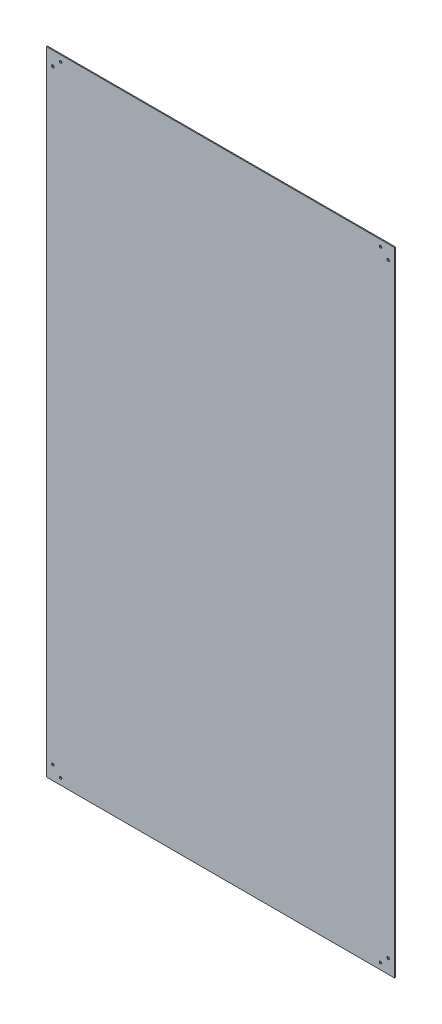
ISO-10303-21;
HEADER;
FILE_DESCRIPTION(('STEP AP214'),'2;1');
FILE_NAME('part.step','',(''),(''),'','','');
FILE_SCHEMA(('AUTOMOTIVE_DESIGN { 1 0 10303 214 1 1 1 1 }'));
ENDSEC;
DATA;
#1=APPLICATION_CONTEXT('core data for automotive mechanical design processes');
#2=APPLICATION_PROTOCOL_DEFINITION('international standard','automotive_design',2000,#1);
#3=PRODUCT_CONTEXT('',#1,'mechanical');
#4=PRODUCT('Part','Part','',(#3));
#5=PRODUCT_RELATED_PRODUCT_CATEGORY('part','',(#4));
#6=PRODUCT_DEFINITION_FORMATION('','',#4);
#7=PRODUCT_DEFINITION_CONTEXT('part definition',#1,'design');
#8=PRODUCT_DEFINITION('design','',#6,#7);
#9=PRODUCT_DEFINITION_SHAPE('','',#8);
#10=(LENGTH_UNIT() NAMED_UNIT(*) SI_UNIT(.MILLI.,.METRE.));
#11=(NAMED_UNIT(*) PLANE_ANGLE_UNIT() SI_UNIT($,.RADIAN.));
#12=(NAMED_UNIT(*) SI_UNIT($,.STERADIAN.) SOLID_ANGLE_UNIT());
#13=UNCERTAINTY_MEASURE_WITH_UNIT(LENGTH_MEASURE(1.E-05),#10,'distance_accuracy_value','');
#14=(GEOMETRIC_REPRESENTATION_CONTEXT(3) GLOBAL_UNCERTAINTY_ASSIGNED_CONTEXT((#13)) GLOBAL_UNIT_ASSIGNED_CONTEXT((#10,
#11,#12)) REPRESENTATION_CONTEXT('',''));
#15=CARTESIAN_POINT('',(0.,0.,0.));
#16=DIRECTION('',(0.,0.,1.));
#17=DIRECTION('',(1.,0.,0.));
#18=AXIS2_PLACEMENT_3D('',#15,#16,#17);
#19=CARTESIAN_POINT('',(-550.,-1000.,-3.));
#20=DIRECTION('',(0.,-1.,0.));
#21=DIRECTION('',(0.,0.,-1.));
#22=AXIS2_PLACEMENT_3D('',#19,#20,#21);
#23=PLANE('',#22);
#24=DIRECTION('',(1.,0.,0.));
#25=VECTOR('',#24,1.);
#26=CARTESIAN_POINT('',(-550.,-1000.,0.));
#27=LINE('',#26,#25);
#28=CARTESIAN_POINT('',(-550.,-1000.,0.));
#29=VERTEX_POINT('',#28);
#30=CARTESIAN_POINT('',(550.,-1000.,0.));
#31=VERTEX_POINT('',#30);
#32=EDGE_CURVE('E100',#29,#31,#27,.T.);
#33=ORIENTED_EDGE('',*,*,#32,.F.);
#34=DIRECTION('',(0.,0.,1.));
#35=VECTOR('',#34,1.);
#36=CARTESIAN_POINT('',(-550.,-1000.,-3.));
#37=LINE('',#36,#35);
#38=CARTESIAN_POINT('',(-550.,-1000.,-3.));
#39=VERTEX_POINT('',#38);
#40=EDGE_CURVE('E11',#39,#29,#37,.T.);
#41=ORIENTED_EDGE('',*,*,#40,.F.);
#42=DIRECTION('',(1.,0.,0.));
#43=VECTOR('',#42,1.);
#44=CARTESIAN_POINT('',(-550.,-1000.,-3.));
#45=LINE('',#44,#43);
#46=CARTESIAN_POINT('',(550.,-1000.,-3.));
#47=VERTEX_POINT('',#46);
#48=EDGE_CURVE('E93',#39,#47,#45,.T.);
#49=ORIENTED_EDGE('',*,*,#48,.T.);
#50=DIRECTION('',(0.,0.,1.));
#51=VECTOR('',#50,1.);
#52=CARTESIAN_POINT('',(550.,-1000.,-3.));
#53=LINE('',#52,#51);
#54=EDGE_CURVE('E38',#47,#31,#53,.T.);
#55=ORIENTED_EDGE('',*,*,#54,.T.);
#56=EDGE_LOOP('',(#33,#41,#49,#55));
#57=FACE_BOUND('',#56,.T.);
#58=ADVANCED_FACE('F35',(#57),#23,.T.);
#59=CARTESIAN_POINT('',(-550.,1000.,-3.));
#60=DIRECTION('',(-1.,0.,0.));
#61=DIRECTION('',(0.,-1.,0.));
#62=AXIS2_PLACEMENT_3D('',#59,#60,#61);
#63=PLANE('',#62);
#64=DIRECTION('',(0.,-1.,0.));
#65=VECTOR('',#64,1.);
#66=CARTESIAN_POINT('',(-550.,1000.,0.));
#67=LINE('',#66,#65);
#68=CARTESIAN_POINT('',(-550.,1000.,0.));
#69=VERTEX_POINT('',#68);
#70=EDGE_CURVE('E95',#69,#29,#67,.T.);
#71=ORIENTED_EDGE('',*,*,#70,.F.);
#72=DIRECTION('',(0.,0.,1.));
#73=VECTOR('',#72,1.);
#74=CARTESIAN_POINT('',(-550.,1000.,-3.));
#75=LINE('',#74,#73);
#76=CARTESIAN_POINT('',(-550.,1000.,-3.));
#77=VERTEX_POINT('',#76);
#78=EDGE_CURVE('E44',#77,#69,#75,.T.);
#79=ORIENTED_EDGE('',*,*,#78,.F.);
#80=DIRECTION('',(0.,-1.,0.));
#81=VECTOR('',#80,1.);
#82=CARTESIAN_POINT('',(-550.,1000.,-3.));
#83=LINE('',#82,#81);
#84=EDGE_CURVE('E83',#77,#39,#83,.T.);
#85=ORIENTED_EDGE('',*,*,#84,.T.);
#86=ORIENTED_EDGE('',*,*,#40,.T.);
#87=EDGE_LOOP('',(#71,#79,#85,#86));
#88=FACE_BOUND('',#87,.T.);
#89=ADVANCED_FACE('F111',(#88),#63,.T.);
#90=CARTESIAN_POINT('',(-550.,1000.,-3.));
#91=DIRECTION('',(0.,-1.,0.));
#92=DIRECTION('',(0.,0.,-1.));
#93=AXIS2_PLACEMENT_3D('',#90,#91,#92);
#94=PLANE('',#93);
#95=DIRECTION('',(1.,0.,0.));
#96=VECTOR('',#95,1.);
#97=CARTESIAN_POINT('',(-550.,1000.,0.));
#98=LINE('',#97,#96);
#99=CARTESIAN_POINT('',(550.,1000.,0.));
#100=VERTEX_POINT('',#99);
#101=EDGE_CURVE('E88',#69,#100,#98,.T.);
#102=ORIENTED_EDGE('',*,*,#101,.T.);
#103=DIRECTION('',(0.,0.,1.));
#104=VECTOR('',#103,1.);
#105=CARTESIAN_POINT('',(550.,1000.,-3.));
#106=LINE('',#105,#104);
#107=CARTESIAN_POINT('',(550.,1000.,-3.));
#108=VERTEX_POINT('',#107);
#109=EDGE_CURVE('E86',#108,#100,#106,.T.);
#110=ORIENTED_EDGE('',*,*,#109,.F.);
#111=DIRECTION('',(1.,0.,0.));
#112=VECTOR('',#111,1.);
#113=CARTESIAN_POINT('',(-550.,1000.,-3.));
#114=LINE('',#113,#112);
#115=EDGE_CURVE('E80',#77,#108,#114,.T.);
#116=ORIENTED_EDGE('',*,*,#115,.F.);
#117=ORIENTED_EDGE('',*,*,#78,.T.);
#118=EDGE_LOOP('',(#102,#110,#116,#117));
#119=FACE_BOUND('',#118,.T.);
#120=ADVANCED_FACE('F87',(#119),#94,.F.);
#121=CARTESIAN_POINT('',(550.,1000.,-3.));
#122=DIRECTION('',(-1.,0.,0.));
#123=DIRECTION('',(0.,-1.,0.));
#124=AXIS2_PLACEMENT_3D('',#121,#122,#123);
#125=PLANE('',#124);
#126=DIRECTION('',(0.,-1.,0.));
#127=VECTOR('',#126,1.);
#128=CARTESIAN_POINT('',(550.,1000.,0.));
#129=LINE('',#128,#127);
#130=EDGE_CURVE('E103',#100,#31,#129,.T.);
#131=ORIENTED_EDGE('',*,*,#130,.T.);
#132=ORIENTED_EDGE('',*,*,#54,.F.);
#133=DIRECTION('',(0.,-1.,0.));
#134=VECTOR('',#133,1.);
#135=CARTESIAN_POINT('',(550.,1000.,-3.));
#136=LINE('',#135,#134);
#137=EDGE_CURVE('E77',#108,#47,#136,.T.);
#138=ORIENTED_EDGE('',*,*,#137,.F.);
#139=ORIENTED_EDGE('',*,*,#109,.T.);
#140=EDGE_LOOP('',(#131,#132,#138,#139));
#141=FACE_BOUND('',#140,.T.);
#142=ADVANCED_FACE('F92',(#141),#125,.F.);
#143=CARTESIAN_POINT('',(0.,0.,-3.));
#144=DIRECTION('',(0.,0.,-1.));
#145=DIRECTION('',(-1.,0.,0.));
#146=AXIS2_PLACEMENT_3D('',#143,#144,#145);
#147=PLANE('',#146);
#148=CARTESIAN_POINT('',(-505.75,-980.,-3.));
#149=DIRECTION('',(0.,0.,1.));
#150=DIRECTION('',(1.,0.,0.));
#151=AXIS2_PLACEMENT_3D('',#148,#149,#150);
#152=CIRCLE('',#151,3.99999999999999);
#153=CARTESIAN_POINT('',(-501.75,-980.,-3.));
#154=VERTEX_POINT('',#153);
#155=EDGE_CURVE('E197',#154,#154,#152,.T.);
#156=ORIENTED_EDGE('',*,*,#155,.T.);
#157=EDGE_LOOP('',(#156));
#158=FACE_BOUND('',#157,.T.);
#159=CARTESIAN_POINT('',(530.000000000007,955.749999999996,-3.));
#160=DIRECTION('',(0.,0.,1.));
#161=DIRECTION('',(1.,0.,0.));
#162=AXIS2_PLACEMENT_3D('',#159,#160,#161);
#163=CIRCLE('',#162,3.99999999999999);
#164=CARTESIAN_POINT('',(534.000000000007,955.749999999996,-3.));
#165=VERTEX_POINT('',#164);
#166=EDGE_CURVE('E190',#165,#165,#163,.T.);
#167=ORIENTED_EDGE('',*,*,#166,.T.);
#168=EDGE_LOOP('',(#167));
#169=FACE_BOUND('',#168,.T.);
#170=CARTESIAN_POINT('',(-530.,955.75,-3.));
#171=DIRECTION('',(0.,0.,1.));
#172=DIRECTION('',(-1.,0.,0.));
#173=AXIS2_PLACEMENT_3D('',#170,#171,#172);
#174=CIRCLE('',#173,3.99999999999999);
#175=CARTESIAN_POINT('',(-534.,955.75,-3.));
#176=VERTEX_POINT('',#175);
#177=EDGE_CURVE('E208',#176,#176,#174,.T.);
#178=ORIENTED_EDGE('',*,*,#177,.T.);
#179=EDGE_LOOP('',(#178));
#180=FACE_BOUND('',#179,.T.);
#181=CARTESIAN_POINT('',(530.000000000007,-955.749999999996,-3.));
#182=DIRECTION('',(0.,0.,1.));
#183=DIRECTION('',(-1.,0.,0.));
#184=AXIS2_PLACEMENT_3D('',#181,#182,#183);
#185=CIRCLE('',#184,3.99999999999999);
#186=CARTESIAN_POINT('',(526.000000000007,-955.749999999996,-3.));
#187=VERTEX_POINT('',#186);
#188=EDGE_CURVE('E201',#187,#187,#185,.T.);
#189=ORIENTED_EDGE('',*,*,#188,.T.);
#190=EDGE_LOOP('',(#189));
#191=FACE_BOUND('',#190,.T.);
#192=CARTESIAN_POINT('',(505.750000000007,-979.999999999997,-3.));
#193=DIRECTION('',(0.,0.,1.));
#194=DIRECTION('',(-1.,0.,0.));
#195=AXIS2_PLACEMENT_3D('',#192,#193,#194);
#196=CIRCLE('',#195,3.99999999999999);
#197=CARTESIAN_POINT('',(501.750000000007,-979.999999999997,-3.));
#198=VERTEX_POINT('',#197);
#199=EDGE_CURVE('E169',#198,#198,#196,.T.);
#200=ORIENTED_EDGE('',*,*,#199,.T.);
#201=EDGE_LOOP('',(#200));
#202=FACE_BOUND('',#201,.T.);
#203=CARTESIAN_POINT('',(505.750000000007,979.999999999997,-3.));
#204=DIRECTION('',(0.,0.,1.));
#205=DIRECTION('',(1.,0.,0.));
#206=AXIS2_PLACEMENT_3D('',#203,#204,#205);
#207=CIRCLE('',#206,3.99999999999999);
#208=CARTESIAN_POINT('',(509.750000000007,979.999999999997,-3.));
#209=VERTEX_POINT('',#208);
#210=EDGE_CURVE('E174',#209,#209,#207,.T.);
#211=ORIENTED_EDGE('',*,*,#210,.T.);
#212=EDGE_LOOP('',(#211));
#213=FACE_BOUND('',#212,.T.);
#214=CARTESIAN_POINT('',(-505.75,980.,-3.));
#215=DIRECTION('',(0.,0.,1.));
#216=DIRECTION('',(-1.,0.,0.));
#217=AXIS2_PLACEMENT_3D('',#214,#215,#216);
#218=CIRCLE('',#217,3.99999999999999);
#219=CARTESIAN_POINT('',(-509.75,980.,-3.));
#220=VERTEX_POINT('',#219);
#221=EDGE_CURVE('E184',#220,#220,#218,.T.);
#222=ORIENTED_EDGE('',*,*,#221,.T.);
#223=EDGE_LOOP('',(#222));
#224=FACE_BOUND('',#223,.T.);
#225=CARTESIAN_POINT('',(-530.,-955.75,-3.));
#226=DIRECTION('',(0.,0.,1.));
#227=DIRECTION('',(1.,0.,0.));
#228=AXIS2_PLACEMENT_3D('',#225,#226,#227);
#229=CIRCLE('',#228,3.99999999999999);
#230=CARTESIAN_POINT('',(-526.,-955.75,-3.));
#231=VERTEX_POINT('',#230);
#232=EDGE_CURVE('E104',#231,#231,#229,.T.);
#233=ORIENTED_EDGE('',*,*,#232,.T.);
#234=EDGE_LOOP('',(#233));
#235=FACE_BOUND('',#234,.T.);
#236=ORIENTED_EDGE('',*,*,#48,.F.);
#237=ORIENTED_EDGE('',*,*,#84,.F.);
#238=ORIENTED_EDGE('',*,*,#115,.T.);
#239=ORIENTED_EDGE('',*,*,#137,.T.);
#240=EDGE_LOOP('',(#236,#237,#238,#239));
#241=FACE_BOUND('',#240,.T.);
#242=ADVANCED_FACE('F82',(#158,#169,#180,#191,#202,#213,#224,#235,#241),#147,.T.);
#243=CARTESIAN_POINT('',(0.,0.,0.));
#244=DIRECTION('',(0.,0.,-1.));
#245=DIRECTION('',(-1.,0.,0.));
#246=AXIS2_PLACEMENT_3D('',#243,#244,#245);
#247=PLANE('',#246);
#248=CARTESIAN_POINT('',(-505.75,-980.,0.));
#249=DIRECTION('',(0.,0.,1.));
#250=DIRECTION('',(1.,0.,0.));
#251=AXIS2_PLACEMENT_3D('',#248,#249,#250);
#252=CIRCLE('',#251,3.99999999999999);
#253=CARTESIAN_POINT('',(-501.75,-980.,0.));
#254=VERTEX_POINT('',#253);
#255=EDGE_CURVE('E176',#254,#254,#252,.T.);
#256=ORIENTED_EDGE('',*,*,#255,.F.);
#257=EDGE_LOOP('',(#256));
#258=FACE_BOUND('',#257,.T.);
#259=CARTESIAN_POINT('',(530.000000000007,955.749999999996,0.));
#260=DIRECTION('',(0.,0.,1.));
#261=DIRECTION('',(1.,0.,0.));
#262=AXIS2_PLACEMENT_3D('',#259,#260,#261);
#263=CIRCLE('',#262,3.99999999999999);
#264=CARTESIAN_POINT('',(534.000000000007,955.749999999996,0.));
#265=VERTEX_POINT('',#264);
#266=EDGE_CURVE('E194',#265,#265,#263,.T.);
#267=ORIENTED_EDGE('',*,*,#266,.F.);
#268=EDGE_LOOP('',(#267));
#269=FACE_BOUND('',#268,.T.);
#270=CARTESIAN_POINT('',(-530.,955.75,0.));
#271=DIRECTION('',(0.,0.,1.));
#272=DIRECTION('',(-1.,0.,0.));
#273=AXIS2_PLACEMENT_3D('',#270,#271,#272);
#274=CIRCLE('',#273,3.99999999999999);
#275=CARTESIAN_POINT('',(-534.,955.75,0.));
#276=VERTEX_POINT('',#275);
#277=EDGE_CURVE('E193',#276,#276,#274,.T.);
#278=ORIENTED_EDGE('',*,*,#277,.F.);
#279=EDGE_LOOP('',(#278));
#280=FACE_BOUND('',#279,.T.);
#281=CARTESIAN_POINT('',(530.000000000007,-955.749999999996,0.));
#282=DIRECTION('',(0.,0.,1.));
#283=DIRECTION('',(-1.,0.,0.));
#284=AXIS2_PLACEMENT_3D('',#281,#282,#283);
#285=CIRCLE('',#284,3.99999999999999);
#286=CARTESIAN_POINT('',(526.000000000007,-955.749999999996,0.));
#287=VERTEX_POINT('',#286);
#288=EDGE_CURVE('E205',#287,#287,#285,.T.);
#289=ORIENTED_EDGE('',*,*,#288,.F.);
#290=EDGE_LOOP('',(#289));
#291=FACE_BOUND('',#290,.T.);
#292=CARTESIAN_POINT('',(505.750000000007,-979.999999999997,0.));
#293=DIRECTION('',(0.,0.,1.));
#294=DIRECTION('',(-1.,0.,0.));
#295=AXIS2_PLACEMENT_3D('',#292,#293,#294);
#296=CIRCLE('',#295,3.99999999999999);
#297=CARTESIAN_POINT('',(501.750000000007,-979.999999999997,0.));
#298=VERTEX_POINT('',#297);
#299=EDGE_CURVE('E172',#298,#298,#296,.T.);
#300=ORIENTED_EDGE('',*,*,#299,.F.);
#301=EDGE_LOOP('',(#300));
#302=FACE_BOUND('',#301,.T.);
#303=CARTESIAN_POINT('',(505.750000000007,979.999999999997,0.));
#304=DIRECTION('',(0.,0.,1.));
#305=DIRECTION('',(1.,0.,0.));
#306=AXIS2_PLACEMENT_3D('',#303,#304,#305);
#307=CIRCLE('',#306,3.99999999999999);
#308=CARTESIAN_POINT('',(509.750000000007,979.999999999997,0.));
#309=VERTEX_POINT('',#308);
#310=EDGE_CURVE('E179',#309,#309,#307,.T.);
#311=ORIENTED_EDGE('',*,*,#310,.F.);
#312=EDGE_LOOP('',(#311));
#313=FACE_BOUND('',#312,.T.);
#314=CARTESIAN_POINT('',(-505.75,980.,0.));
#315=DIRECTION('',(0.,0.,1.));
#316=DIRECTION('',(-1.,0.,0.));
#317=AXIS2_PLACEMENT_3D('',#314,#315,#316);
#318=CIRCLE('',#317,3.99999999999999);
#319=CARTESIAN_POINT('',(-509.75,980.,0.));
#320=VERTEX_POINT('',#319);
#321=EDGE_CURVE('E187',#320,#320,#318,.T.);
#322=ORIENTED_EDGE('',*,*,#321,.F.);
#323=EDGE_LOOP('',(#322));
#324=FACE_BOUND('',#323,.T.);
#325=CARTESIAN_POINT('',(-530.,-955.75,0.));
#326=DIRECTION('',(0.,0.,1.));
#327=DIRECTION('',(1.,0.,0.));
#328=AXIS2_PLACEMENT_3D('',#325,#326,#327);
#329=CIRCLE('',#328,3.99999999999999);
#330=CARTESIAN_POINT('',(-526.,-955.75,0.));
#331=VERTEX_POINT('',#330);
#332=EDGE_CURVE('E204',#331,#331,#329,.T.);
#333=ORIENTED_EDGE('',*,*,#332,.F.);
#334=EDGE_LOOP('',(#333));
#335=FACE_BOUND('',#334,.T.);
#336=ORIENTED_EDGE('',*,*,#32,.T.);
#337=ORIENTED_EDGE('',*,*,#130,.F.);
#338=ORIENTED_EDGE('',*,*,#101,.F.);
#339=ORIENTED_EDGE('',*,*,#70,.T.);
#340=EDGE_LOOP('',(#336,#337,#338,#339));
#341=FACE_BOUND('',#340,.T.);
#342=ADVANCED_FACE('F110',(#258,#269,#280,#291,#302,#313,#324,#335,#341),#247,.F.);
#343=CARTESIAN_POINT('',(-530.,-955.75,-3.));
#344=DIRECTION('',(0.,0.,1.));
#345=DIRECTION('',(1.,0.,0.));
#346=AXIS2_PLACEMENT_3D('',#343,#344,#345);
#347=CYLINDRICAL_SURFACE('',#346,3.99999999999999);
#348=ORIENTED_EDGE('',*,*,#232,.F.);
#349=EDGE_LOOP('',(#348));
#350=FACE_BOUND('',#349,.T.);
#351=ORIENTED_EDGE('',*,*,#332,.T.);
#352=EDGE_LOOP('',(#351));
#353=FACE_BOUND('',#352,.T.);
#354=ADVANCED_FACE('F129',(#350,#353),#347,.F.);
#355=CARTESIAN_POINT('',(-505.75,980.,-3.));
#356=DIRECTION('',(0.,0.,1.));
#357=DIRECTION('',(1.,0.,0.));
#358=AXIS2_PLACEMENT_3D('',#355,#356,#357);
#359=CYLINDRICAL_SURFACE('',#358,3.99999999999999);
#360=ORIENTED_EDGE('',*,*,#221,.F.);
#361=EDGE_LOOP('',(#360));
#362=FACE_BOUND('',#361,.T.);
#363=ORIENTED_EDGE('',*,*,#321,.T.);
#364=EDGE_LOOP('',(#363));
#365=FACE_BOUND('',#364,.T.);
#366=ADVANCED_FACE('F136',(#362,#365),#359,.F.);
#367=CARTESIAN_POINT('',(505.750000000007,979.999999999997,-3.));
#368=DIRECTION('',(0.,0.,1.));
#369=DIRECTION('',(1.,0.,0.));
#370=AXIS2_PLACEMENT_3D('',#367,#368,#369);
#371=CYLINDRICAL_SURFACE('',#370,3.99999999999999);
#372=ORIENTED_EDGE('',*,*,#210,.F.);
#373=EDGE_LOOP('',(#372));
#374=FACE_BOUND('',#373,.T.);
#375=ORIENTED_EDGE('',*,*,#310,.T.);
#376=EDGE_LOOP('',(#375));
#377=FACE_BOUND('',#376,.T.);
#378=ADVANCED_FACE('F157',(#374,#377),#371,.F.);
#379=CARTESIAN_POINT('',(505.750000000007,-979.999999999997,-3.));
#380=DIRECTION('',(0.,0.,1.));
#381=DIRECTION('',(1.,0.,0.));
#382=AXIS2_PLACEMENT_3D('',#379,#380,#381);
#383=CYLINDRICAL_SURFACE('',#382,3.99999999999999);
#384=ORIENTED_EDGE('',*,*,#199,.F.);
#385=EDGE_LOOP('',(#384));
#386=FACE_BOUND('',#385,.T.);
#387=ORIENTED_EDGE('',*,*,#299,.T.);
#388=EDGE_LOOP('',(#387));
#389=FACE_BOUND('',#388,.T.);
#390=ADVANCED_FACE('F146',(#386,#389),#383,.F.);
#391=CARTESIAN_POINT('',(530.000000000007,-955.749999999996,-3.));
#392=DIRECTION('',(0.,0.,1.));
#393=DIRECTION('',(1.,0.,0.));
#394=AXIS2_PLACEMENT_3D('',#391,#392,#393);
#395=CYLINDRICAL_SURFACE('',#394,3.99999999999999);
#396=ORIENTED_EDGE('',*,*,#188,.F.);
#397=EDGE_LOOP('',(#396));
#398=FACE_BOUND('',#397,.T.);
#399=ORIENTED_EDGE('',*,*,#288,.T.);
#400=EDGE_LOOP('',(#399));
#401=FACE_BOUND('',#400,.T.);
#402=ADVANCED_FACE('F142',(#398,#401),#395,.F.);
#403=CARTESIAN_POINT('',(-530.,955.75,-3.));
#404=DIRECTION('',(0.,0.,1.));
#405=DIRECTION('',(1.,0.,0.));
#406=AXIS2_PLACEMENT_3D('',#403,#404,#405);
#407=CYLINDRICAL_SURFACE('',#406,3.99999999999999);
#408=ORIENTED_EDGE('',*,*,#177,.F.);
#409=EDGE_LOOP('',(#408));
#410=FACE_BOUND('',#409,.T.);
#411=ORIENTED_EDGE('',*,*,#277,.T.);
#412=EDGE_LOOP('',(#411));
#413=FACE_BOUND('',#412,.T.);
#414=ADVANCED_FACE('F138',(#410,#413),#407,.F.);
#415=CARTESIAN_POINT('',(530.000000000007,955.749999999996,-3.));
#416=DIRECTION('',(0.,0.,1.));
#417=DIRECTION('',(1.,0.,0.));
#418=AXIS2_PLACEMENT_3D('',#415,#416,#417);
#419=CYLINDRICAL_SURFACE('',#418,3.99999999999999);
#420=ORIENTED_EDGE('',*,*,#166,.F.);
#421=EDGE_LOOP('',(#420));
#422=FACE_BOUND('',#421,.T.);
#423=ORIENTED_EDGE('',*,*,#266,.T.);
#424=EDGE_LOOP('',(#423));
#425=FACE_BOUND('',#424,.T.);
#426=ADVANCED_FACE('F141',(#422,#425),#419,.F.);
#427=CARTESIAN_POINT('',(-505.75,-980.,-3.));
#428=DIRECTION('',(0.,0.,1.));
#429=DIRECTION('',(1.,0.,0.));
#430=AXIS2_PLACEMENT_3D('',#427,#428,#429);
#431=CYLINDRICAL_SURFACE('',#430,3.99999999999999);
#432=ORIENTED_EDGE('',*,*,#155,.F.);
#433=EDGE_LOOP('',(#432));
#434=FACE_BOUND('',#433,.T.);
#435=ORIENTED_EDGE('',*,*,#255,.T.);
#436=EDGE_LOOP('',(#435));
#437=FACE_BOUND('',#436,.T.);
#438=ADVANCED_FACE('F148',(#434,#437),#431,.F.);
#439=CLOSED_SHELL('',(#58,#89,#120,#142,#242,#342,#354,#366,#378,#390,#402,#414,#426,#438));
#440=MANIFOLD_SOLID_BREP('B2',#439);
#441=ADVANCED_BREP_SHAPE_REPRESENTATION('',(#18,#440),#14);
#442=SHAPE_DEFINITION_REPRESENTATION(#9,#441);
ENDSEC;
END-ISO-10303-21;
